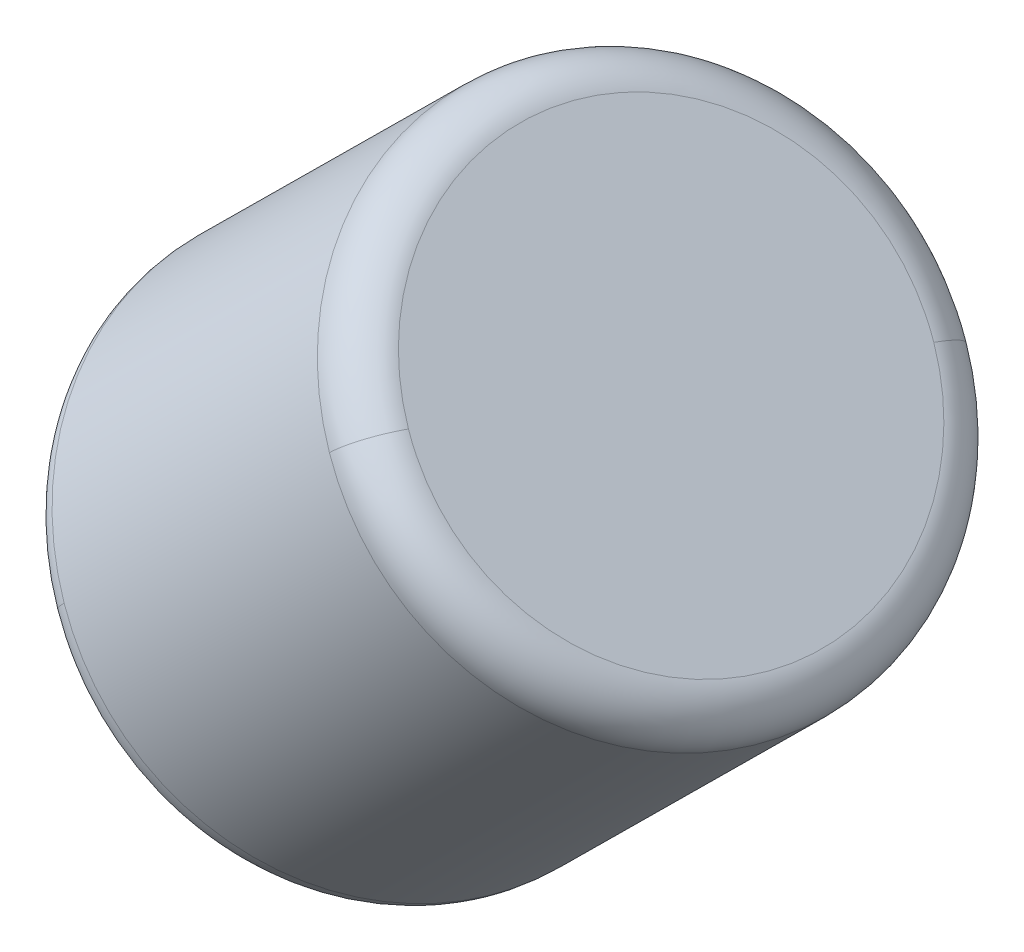
ISO-10303-21;
HEADER;
FILE_DESCRIPTION(('STEP AP214'),'2;1');
FILE_NAME('part.step','',(''),(''),'','','');
FILE_SCHEMA(('AUTOMOTIVE_DESIGN { 1 0 10303 214 1 1 1 1 }'));
ENDSEC;
DATA;
#1=APPLICATION_CONTEXT('core data for automotive mechanical design processes');
#2=APPLICATION_PROTOCOL_DEFINITION('international standard','automotive_design',2000,#1);
#3=PRODUCT_CONTEXT('',#1,'mechanical');
#4=PRODUCT('Part','Part','',(#3));
#5=PRODUCT_RELATED_PRODUCT_CATEGORY('part','',(#4));
#6=PRODUCT_DEFINITION_FORMATION('','',#4);
#7=PRODUCT_DEFINITION_CONTEXT('part definition',#1,'design');
#8=PRODUCT_DEFINITION('design','',#6,#7);
#9=PRODUCT_DEFINITION_SHAPE('','',#8);
#10=(LENGTH_UNIT() NAMED_UNIT(*) SI_UNIT(.MILLI.,.METRE.));
#11=(NAMED_UNIT(*) PLANE_ANGLE_UNIT() SI_UNIT($,.RADIAN.));
#12=(NAMED_UNIT(*) SI_UNIT($,.STERADIAN.) SOLID_ANGLE_UNIT());
#13=UNCERTAINTY_MEASURE_WITH_UNIT(LENGTH_MEASURE(1.E-05),#10,'distance_accuracy_value','');
#14=(GEOMETRIC_REPRESENTATION_CONTEXT(3) GLOBAL_UNCERTAINTY_ASSIGNED_CONTEXT((#13)) GLOBAL_UNIT_ASSIGNED_CONTEXT((#10,
#11,#12)) REPRESENTATION_CONTEXT('',''));
#15=CARTESIAN_POINT('',(0.,0.,0.));
#16=DIRECTION('',(0.,0.,1.));
#17=DIRECTION('',(1.,0.,0.));
#18=AXIS2_PLACEMENT_3D('',#15,#16,#17);
#19=CARTESIAN_POINT('',(10.1213203435597,49.7260987621381,6.28186714917047));
#20=DIRECTION('',(-0.707106781186513,-0.701531033014368,-0.0886239793613581));
#21=DIRECTION('',(0.704302354575459,-0.709900129130475,0.));
#22=AXIS2_PLACEMENT_3D('',#19,#20,#21);
#23=PLANE('',#22);
#24=CARTESIAN_POINT('',(9.42762951289511,50.1261189747011,8.65015278671473));
#25=CARTESIAN_POINT('',(9.40102429993113,50.15452615074,8.63756263833869));
#26=CARTESIAN_POINT('',(9.37469819089109,50.1827723565529,8.62401980572352));
#27=CARTESIAN_POINT('',(9.32266642371247,50.23887551971,8.59506494932473));
#28=CARTESIAN_POINT('',(9.29696076557391,50.2667324770543,8.5796529255411));
#29=CARTESIAN_POINT('',(9.24623214325189,50.3219898352575,8.54699586411519));
#30=CARTESIAN_POINT('',(9.22120917906843,50.3493902361165,8.5297508264729));
#31=CARTESIAN_POINT('',(9.17190614253156,50.403668524482,8.49346953711775));
#32=CARTESIAN_POINT('',(9.14762607017813,50.4305464119886,8.47443328540487));
#33=CARTESIAN_POINT('',(9.09986733280087,50.4837149082364,8.4346153595841));
#34=CARTESIAN_POINT('',(9.07638866777703,50.5100055169776,8.4138336854762));
#35=CARTESIAN_POINT('',(9.03028930114275,50.5619361231277,8.37057499804543));
#36=CARTESIAN_POINT('',(9.00766859953231,50.5875761205366,8.34809798472257));
#37=CARTESIAN_POINT('',(8.96333965660461,50.6381437340011,8.30150276305041));
#38=CARTESIAN_POINT('',(8.94163141528735,50.6630713500567,8.27738455470112));
#39=CARTESIAN_POINT('',(8.89917968956446,50.7121541482777,8.2275650471669));
#40=CARTESIAN_POINT('',(8.87843620515883,50.7363093304432,8.20186374798197));
#41=CARTESIAN_POINT('',(8.83796396624697,50.783789068861,8.1489399751052));
#42=CARTESIAN_POINT('',(8.81823521174073,50.8071136251135,8.12171750141335));
#43=CARTESIAN_POINT('',(8.77983996089395,50.8528759208259,8.06581696094064));
#44=CARTESIAN_POINT('',(8.76117346455342,50.8753136602859,8.03713889415978));
#45=CARTESIAN_POINT('',(8.72494769927112,50.9192482679286,7.97839625545853));
#46=CARTESIAN_POINT('',(8.70738843032936,50.9407451361113,7.94833168353814));
#47=CARTESIAN_POINT('',(8.67341942165925,50.9827462133624,7.88688846275171));
#48=CARTESIAN_POINT('',(8.6570096819309,51.0032504224309,7.85550981388567));
#49=CARTESIAN_POINT('',(8.62537926418855,51.0432167850174,7.79151403311969));
#50=CARTESIAN_POINT('',(8.61015858617455,51.0626789385356,7.75889690121975));
#51=CARTESIAN_POINT('',(8.58094295980724,51.1005143039893,7.69250273191412));
#52=CARTESIAN_POINT('',(8.56694801145393,51.1188875159248,7.65872569450844));
#53=CARTESIAN_POINT('',(8.54021755946446,51.1545007355363,7.59009308603282));
#54=CARTESIAN_POINT('',(8.52748205582828,51.1717407432122,7.55523751496288));
#55=CARTESIAN_POINT('',(8.50330117421682,51.2050460216161,7.4845318092825));
#56=CARTESIAN_POINT('',(8.49185579624153,51.221111292344,7.44868167467206));
#57=CARTESIAN_POINT('',(8.47028273886987,51.2520283942073,7.37607320802501));
#58=CARTESIAN_POINT('',(8.4601550594735,51.2668802253428,7.33931487598842));
#59=CARTESIAN_POINT('',(8.44124179772643,51.2953346686593,7.26497856853061));
#60=CARTESIAN_POINT('',(8.43245621537573,51.3089372808402,7.22740059310939));
#61=CARTESIAN_POINT('',(8.4162483129574,51.3348605163636,7.15151552751657));
#62=CARTESIAN_POINT('',(8.40882599288977,51.3471811397059,7.11320843734497));
#63=CARTESIAN_POINT('',(8.39536249605676,51.370510716091,7.0359574273869));
#64=CARTESIAN_POINT('',(8.38932131929137,51.3815196691339,6.99701350760043));
#65=CARTESIAN_POINT('',(8.37863466278681,51.402199383388,6.9185826577265));
#66=CARTESIAN_POINT('',(8.37398918304764,51.4118701445992,6.87909572763902));
#67=CARTESIAN_POINT('',(8.36610511196308,51.4298501774792,6.79967398463629));
#68=CARTESIAN_POINT('',(8.3628665206177,51.438159449148,6.75973917172103));
#69=CARTESIAN_POINT('',(8.35780402837096,51.45339648518,6.67951786952492));
#70=CARTESIAN_POINT('',(8.3559801274696,51.4603242495431,6.63923138024407));
#71=CARTESIAN_POINT('',(8.35375141004792,51.4727815813724,6.55840377899813));
#72=CARTESIAN_POINT('',(8.3533465935276,51.4783111488387,6.51786266703304));
#73=CARTESIAN_POINT('',(8.35395702010646,51.4879587656621,6.43662348750834));
#74=CARTESIAN_POINT('',(8.35497226320564,51.4920768150191,6.39592541994872));
#75=CARTESIAN_POINT('',(8.35842036321394,51.4988914748825,6.31447037444443));
#76=CARTESIAN_POINT('',(8.36085322012307,51.5015880853887,6.27371339649977));
#77=CARTESIAN_POINT('',(8.36713068678588,51.5055533711796,6.19223871735514));
#78=CARTESIAN_POINT('',(8.37097529653956,51.5068220464641,6.15152101615518));
#79=CARTESIAN_POINT('',(8.38006700688984,51.5079284054617,6.07022298300861));
#80=CARTESIAN_POINT('',(8.38531410748644,51.5077660891746,6.029642651062));
#81=CARTESIAN_POINT('',(8.39719815879763,51.5060108560632,5.94871711799621));
#82=CARTESIAN_POINT('',(8.40383510951222,51.5044179392387,5.90837191687703));
#83=CARTESIAN_POINT('',(8.41848287206378,51.4998053425285,5.8280138405894));
#84=CARTESIAN_POINT('',(8.42649368390075,51.4967856626428,5.78800096542096));
#85=CARTESIAN_POINT('',(8.4438698699497,51.4893268144833,5.70840393555582));
#86=CARTESIAN_POINT('',(8.45323524416168,51.4848876462097,5.66881978085912));
#87=CARTESIAN_POINT('',(8.47329799295386,51.4746005156195,5.59017555363328));
#88=CARTESIAN_POINT('',(8.48399536753406,51.4687525533031,5.55111548110414));
#89=CARTESIAN_POINT('',(8.50669634615034,51.4556619228809,5.47361351734942));
#90=CARTESIAN_POINT('',(8.51869995018642,51.4484192547752,5.43517162612383));
#91=CARTESIAN_POINT('',(8.54398446998093,51.4325566609963,5.35899863485927));
#92=CARTESIAN_POINT('',(8.55726538573938,51.4239367353231,5.3212675348203));
#93=CARTESIAN_POINT('',(8.58507253408929,51.4053403925652,5.24660702345383));
#94=CARTESIAN_POINT('',(8.59959876668076,51.3953639754805,5.20967761212633));
#95=CARTESIAN_POINT('',(8.62986155373007,51.3740786839622,5.13670944436932));
#96=CARTESIAN_POINT('',(8.64559810818791,51.3627698095286,5.10067068793981));
#97=CARTESIAN_POINT('',(8.67824362823191,51.3388468473815,5.02957065049965));
#98=CARTESIAN_POINT('',(8.69515259381807,51.3262327596681,4.99450936948899));
#99=CARTESIAN_POINT('',(8.73010220093956,51.2997297594035,4.92544874858349));
#100=CARTESIAN_POINT('',(8.7481428424749,51.2858408468523,4.89144940868865));
#101=CARTESIAN_POINT('',(8.78531234000911,51.2568216565192,4.82459457740257));
#102=CARTESIAN_POINT('',(8.80444119600799,51.2416913787373,4.79173908601133));
#103=CARTESIAN_POINT('',(8.84374103937969,51.2102259081069,4.72725110348903));
#104=CARTESIAN_POINT('',(8.86391202675251,51.1938907152586,4.69561861235797));
#105=CARTESIAN_POINT('',(8.90524753919677,51.1600547674058,4.63365283579783));
#106=CARTESIAN_POINT('',(8.92641206426819,51.1425540124014,4.60331955036875));
#107=CARTESIAN_POINT('',(8.96968366491495,51.1064291010882,4.54402526075407));
#108=CARTESIAN_POINT('',(8.99179074049029,51.0878049447795,4.51506425656846));
#109=CARTESIAN_POINT('',(9.03689418426345,51.0494780980815,4.45858429903647));
#110=CARTESIAN_POINT('',(9.05989055246128,51.0297754076923,4.43106534569009));
#111=CARTESIAN_POINT('',(9.10671718121421,50.9893389583401,4.37753578540556));
#112=CARTESIAN_POINT('',(9.1305474417693,50.9686051993773,4.3515251784674));
#113=CARTESIAN_POINT('',(9.1789844460518,50.9261565623194,4.30107497282969));
#114=CARTESIAN_POINT('',(9.20359118977919,50.9044416842243,4.27663537413012));
#115=CARTESIAN_POINT('',(9.25352188060536,50.8600831219453,4.22938606210352));
#116=CARTESIAN_POINT('',(9.27884582770412,50.8374394377614,4.20657634877648));
#117=CARTESIAN_POINT('',(9.33014991766634,50.7912778139231,4.16264175809221));
#118=CARTESIAN_POINT('',(9.35613006052979,50.7677598742689,4.14151688073499));
#119=CARTESIAN_POINT('',(9.40868395358165,50.7199063962666,4.10100285367023));
#120=CARTESIAN_POINT('',(9.43525770377004,50.6955708579186,4.0816137039627));
#121=CARTESIAN_POINT('',(9.48893479297998,50.6461408089721,4.04461784235726));
#122=CARTESIAN_POINT('',(9.51603813200153,50.6210462983738,4.02701113045936));
#123=CARTESIAN_POINT('',(9.5707091045601,50.5701587598007,3.9936225605843));
#124=CARTESIAN_POINT('',(9.59827673809712,50.544365731826,3.97784070260714));
#125=CARTESIAN_POINT('',(9.65380988684281,50.492143296164,3.94813986045181));
#126=CARTESIAN_POINT('',(9.68177540205147,50.4657138884766,3.93422087627363));
#127=CARTESIAN_POINT('',(9.73803694276484,50.4122823641472,3.90827931376816));
#128=CARTESIAN_POINT('',(9.76633296826955,50.3852802475052,3.89625673544087));
#129=CARTESIAN_POINT('',(9.82318736197101,50.3307683557306,3.87413694808192));
#130=CARTESIAN_POINT('',(9.85174573016775,50.3032585805981,3.86403973905026));
#131=CARTESIAN_POINT('',(9.90905600964335,50.2477976453002,3.84579501534167));
#132=CARTESIAN_POINT('',(9.93780792092221,50.2198464851348,3.83764750066474));
#133=CARTESIAN_POINT('',(9.99543602068761,50.1635701165651,3.8233217937491));
#134=CARTESIAN_POINT('',(10.0243122091742,50.1352449081608,3.81714360151039));
#135=CARTESIAN_POINT('',(10.0821192980943,50.078288681018,3.80677142325132));
#136=CARTESIAN_POINT('',(10.1110501985278,50.0496576622795,3.80257743723097));
#137=CARTESIAN_POINT('',(10.168897014244,49.9921587891128,3.79618377518572));
#138=CARTESIAN_POINT('',(10.1978129295265,49.9632909346847,3.79398409916083));
#139=CARTESIAN_POINT('',(10.2555601140607,49.9053879352811,3.79158435595511));
#140=CARTESIAN_POINT('',(10.2843913833123,49.8763527903057,3.79138428877429));
#141=CARTESIAN_POINT('',(10.3418998183856,49.8181851581924,3.79298424659307));
#142=CARTESIAN_POINT('',(10.3705769842072,49.7890526710546,3.79478427159269));
#143=CARTESIAN_POINT('',(10.427708127908,49.7307605366673,3.80038007229002));
#144=CARTESIAN_POINT('',(10.4561621057873,49.7016008894178,3.80417584798773));
#145=CARTESIAN_POINT('',(10.5127783206567,49.643324685424,3.81375402462594));
#146=CARTESIAN_POINT('',(10.5409405576469,49.6142081286795,3.81953642556643));
#147=CARTESIAN_POINT('',(10.5969054634375,49.5560882408043,3.83307385184109));
#148=CARTESIAN_POINT('',(10.6247081322379,49.5270849096735,3.84082887717528));
#149=CARTESIAN_POINT('',(10.6798868554265,49.4692613790259,3.85829313295618));
#150=CARTESIAN_POINT('',(10.7072629098147,49.440441179509,3.8680023634029));
#151=CARTESIAN_POINT('',(10.7615227035036,49.3830532139603,3.8893506565445));
#152=CARTESIAN_POINT('',(10.7884064428043,49.3544854479285,3.90098971923938));
#153=CARTESIAN_POINT('',(10.8150111742237,49.3260785495746,3.91358151162614));
#154=B_SPLINE_CURVE_WITH_KNOTS('',3,(#24,#25,#26,#27,#28,#29,#30,#31,#32,#33,#34,#35,#36,#37,
#38,#39,#40,#41,#42,#43,#44,#45,#46,#47,#48,#49,#50,#51,#52,#53,#54,#55,#56,#57,#58,#59,#60,#61,
#62,#63,#64,#65,#66,#67,#68,#69,#70,#71,#72,#73,#74,#75,#76,#77,#78,#79,#80,#81,#82,#83,#84,#85,
#86,#87,#88,#89,#90,#91,#92,#93,#94,#95,#96,#97,#98,#99,#100,#101,#102,#103,#104,#105,#106,#107,
#108,#109,#110,#111,#112,#113,#114,#115,#116,#117,#118,#119,#120,#121,#122,#123,#124,#125,#126,
#127,#128,#129,#130,#131,#132,#133,#134,#135,#136,#137,#138,#139,#140,#141,#142,#143,#144,#145,
#146,#147,#148,#149,#150,#151,#152,#153),.UNSPECIFIED.,.F.,.F.,(4,2,2,2,2,2,2,2,2,2,2,2,2,2,2,2,
2,2,2,2,2,2,2,2,2,2,2,2,2,2,2,2,2,2,2,2,2,2,2,2,2,2,2,2,2,2,2,2,2,2,2,2,2,2,2,2,2,2,2,2,2,2,2,2,
4),(0.,0.122706142614616,0.245412285229231,0.368118427843847,0.490824570458458,
0.613530713073075,0.736236855687689,0.858942998302303,0.981649140916921,1.10435528353153,
1.22706142614615,1.34976756876077,1.47247371137538,1.59517985398999,1.71788599660461,
1.84059213921922,1.96329828183384,2.08600442444845,2.20871056706307,2.33141670967768,
2.4541228522923,2.57682899490691,2.69953513752153,2.82224128013614,2.94494742275076,
3.06765356536537,3.19035970797999,3.3130658505946,3.43577199320922,3.55847813582383,
3.68118427843845,3.80389042105306,3.92659656366768,4.04930270628229,4.17200884889691,
4.29471499151152,4.41742113412613,4.54012727674075,4.66283341935537,4.78553956196998,
4.9082457045846,5.03095184719921,5.15365798981383,5.27636413242844,5.39907027504305,
5.52177641765767,5.64448256027228,5.7671887028869,5.88989484550151,6.01260098811613,
6.13530713073074,6.25801327334536,6.38071941595998,6.50342555857459,6.6261317011892,
6.74883784380382,6.87154398641844,6.99425012903305,7.11695627164767,7.23966241426228,
7.36236855687689,7.48507469949151,7.60778084210613,7.73048698472074,7.85319312733535),.UNSPECIFIED.);
#155=CARTESIAN_POINT('',(9.42762951289511,50.1261189747011,8.65015278671473));
#156=VERTEX_POINT('',#155);
#157=CARTESIAN_POINT('',(10.8150111742237,49.3260785495746,3.91358151162614));
#158=VERTEX_POINT('',#157);
#159=EDGE_CURVE('E11',#156,#158,#154,.T.);
#160=ORIENTED_EDGE('',*,*,#159,.F.);
#161=CARTESIAN_POINT('',(10.8150111742237,49.3260785495746,3.91358151162614));
#162=CARTESIAN_POINT('',(10.8416163871877,49.2976713735358,3.92617166000217));
#163=CARTESIAN_POINT('',(10.8679424962277,49.2694251677229,3.93971449261734));
#164=CARTESIAN_POINT('',(10.9199742634063,49.2133220045657,3.96866934901614));
#165=CARTESIAN_POINT('',(10.9456799215449,49.1854650472215,3.98408137279976));
#166=CARTESIAN_POINT('',(10.9964085438669,49.1302076890182,4.01673843422568));
#167=CARTESIAN_POINT('',(11.0214315080504,49.1028072881592,4.03398347186796));
#168=CARTESIAN_POINT('',(11.0707345445873,49.0485289997937,4.07026476122312));
#169=CARTESIAN_POINT('',(11.0950146169407,49.0216511122871,4.08930101293599));
#170=CARTESIAN_POINT('',(11.142773354318,48.9684826160394,4.12911893875676));
#171=CARTESIAN_POINT('',(11.1662520193418,48.9421920072982,4.14990061286467));
#172=CARTESIAN_POINT('',(11.2123513859761,48.890261401148,4.19315930029543));
#173=CARTESIAN_POINT('',(11.2349720875865,48.8646214037391,4.21563631361829));
#174=CARTESIAN_POINT('',(11.2793010305142,48.8140537902746,4.26223153529045));
#175=CARTESIAN_POINT('',(11.3010092718315,48.789126174219,4.28634974363975));
#176=CARTESIAN_POINT('',(11.3434609975544,48.740043375998,4.33616925117397));
#177=CARTESIAN_POINT('',(11.36420448196,48.7158881938326,4.3618705503589));
#178=CARTESIAN_POINT('',(11.4046767208719,48.6684084554147,4.41479432323567));
#179=CARTESIAN_POINT('',(11.4244054753781,48.6450838991623,4.44201679692751));
#180=CARTESIAN_POINT('',(11.4628007262249,48.5993216034498,4.49791733740022));
#181=CARTESIAN_POINT('',(11.4814672225654,48.5768838639898,4.52659540418109));
#182=CARTESIAN_POINT('',(11.5176929878477,48.5329492563471,4.58533804288234));
#183=CARTESIAN_POINT('',(11.5352522567895,48.5114523881644,4.61540261480273));
#184=CARTESIAN_POINT('',(11.5692212654596,48.4694513109133,4.67684583558916));
#185=CARTESIAN_POINT('',(11.5856310051879,48.4489471018449,4.7082244844552));
#186=CARTESIAN_POINT('',(11.6172614229303,48.4089807392583,4.77222026522118));
#187=CARTESIAN_POINT('',(11.6324821009443,48.3895185857401,4.80483739712112));
#188=CARTESIAN_POINT('',(11.6616977273116,48.3516832202864,4.87123156642674));
#189=CARTESIAN_POINT('',(11.6756926756649,48.3333100083509,4.90500860383243));
#190=CARTESIAN_POINT('',(11.7024231276544,48.2976967887395,4.97364121230805));
#191=CARTESIAN_POINT('',(11.7151586312905,48.2804567810635,5.00849678337798));
#192=CARTESIAN_POINT('',(11.739339512902,48.2471515026597,5.07920248905836));
#193=CARTESIAN_POINT('',(11.7507848908773,48.2310862319318,5.11505262366881));
#194=CARTESIAN_POINT('',(11.772357948249,48.2001691300684,5.18766109031585));
#195=CARTESIAN_POINT('',(11.7824856276453,48.1853172989329,5.22441942235245));
#196=CARTESIAN_POINT('',(11.8013988893924,48.1568628556165,5.29875572981026));
#197=CARTESIAN_POINT('',(11.8101844717431,48.1432602434355,5.33633370523147));
#198=CARTESIAN_POINT('',(11.8263923741614,48.1173370079122,5.41221877082429));
#199=CARTESIAN_POINT('',(11.833814694229,48.1050163845699,5.4505258609959));
#200=CARTESIAN_POINT('',(11.8472781910621,48.0816868081847,5.52777687095396));
#201=CARTESIAN_POINT('',(11.8533193678274,48.0706778551418,5.56672079074043));
#202=CARTESIAN_POINT('',(11.864006024332,48.0499981408878,5.64515164061437));
#203=CARTESIAN_POINT('',(11.8686515040712,48.0403273796765,5.68463857070184));
#204=CARTESIAN_POINT('',(11.8765355751557,48.0223473467965,5.76406031370457));
#205=CARTESIAN_POINT('',(11.8797741665011,48.0140380751277,5.80399512661983));
#206=CARTESIAN_POINT('',(11.8848366587479,47.9988010390958,5.88421642881594));
#207=CARTESIAN_POINT('',(11.8866605596492,47.9918732747327,5.92450291809679));
#208=CARTESIAN_POINT('',(11.8888892770709,47.9794159429033,6.00533051934273));
#209=CARTESIAN_POINT('',(11.8892940935912,47.973886375437,6.04587163130782));
#210=CARTESIAN_POINT('',(11.8886836670124,47.9642387586137,6.12711081083252));
#211=CARTESIAN_POINT('',(11.8876684239132,47.9601207092566,6.16780887839214));
#212=CARTESIAN_POINT('',(11.8842203239049,47.9533060493933,6.24926392389643));
#213=CARTESIAN_POINT('',(11.8817874669958,47.950609438887,6.29002090184109));
#214=CARTESIAN_POINT('',(11.8755100003329,47.9466441530962,6.37149558098572));
#215=CARTESIAN_POINT('',(11.8716653905793,47.9453754778116,6.41221328218568));
#216=CARTESIAN_POINT('',(11.862573680229,47.9442691188141,6.49351131533225));
#217=CARTESIAN_POINT('',(11.8573265796324,47.9444314351011,6.53409164727886));
#218=CARTESIAN_POINT('',(11.8454425283212,47.9461866682126,6.61501718034465));
#219=CARTESIAN_POINT('',(11.8388055776066,47.947779585037,6.65536238146383));
#220=CARTESIAN_POINT('',(11.824157815055,47.9523921817472,6.73572045775146));
#221=CARTESIAN_POINT('',(11.8161470032181,47.955411861633,6.7757333329199));
#222=CARTESIAN_POINT('',(11.7987708171691,47.9628707097924,6.85533036278504));
#223=CARTESIAN_POINT('',(11.7894054429571,47.9673098780661,6.89491451748174));
#224=CARTESIAN_POINT('',(11.769342694165,47.9775970086562,6.97355874470758));
#225=CARTESIAN_POINT('',(11.7586453195848,47.9834449709726,7.01261881723672));
#226=CARTESIAN_POINT('',(11.7359443409685,47.9965356013948,7.09012078099144));
#227=CARTESIAN_POINT('',(11.7239407369324,48.0037782695005,7.12856267221703));
#228=CARTESIAN_POINT('',(11.6986562171379,48.0196408632795,7.20473566348159));
#229=CARTESIAN_POINT('',(11.6853753013794,48.0282607889527,7.24246676352056));
#230=CARTESIAN_POINT('',(11.6575681530295,48.0468571317106,7.31712727488703));
#231=CARTESIAN_POINT('',(11.6430419204381,48.0568335487953,7.35405668621453));
#232=CARTESIAN_POINT('',(11.6127791333888,48.0781188403135,7.42702485397154));
#233=CARTESIAN_POINT('',(11.5970425789309,48.0894277147471,7.46306361040105));
#234=CARTESIAN_POINT('',(11.5643970588869,48.1133506768942,7.53416364784121));
#235=CARTESIAN_POINT('',(11.5474880933008,48.1259647646076,7.56922492885187));
#236=CARTESIAN_POINT('',(11.5125384861793,48.1524677648722,7.63828554975737));
#237=CARTESIAN_POINT('',(11.4944978446439,48.1663566774234,7.67228488965222));
#238=CARTESIAN_POINT('',(11.4573283471097,48.1953758677565,7.73913972093829));
#239=CARTESIAN_POINT('',(11.4381994911108,48.2105061455385,7.77199521232953));
#240=CARTESIAN_POINT('',(11.3988996477391,48.2419716161688,7.83648319485183));
#241=CARTESIAN_POINT('',(11.3787286603663,48.2583068090172,7.86811568598289));
#242=CARTESIAN_POINT('',(11.3373931479221,48.2921427568699,7.93008146254303));
#243=CARTESIAN_POINT('',(11.3162286228506,48.3096435118743,7.96041474797211));
#244=CARTESIAN_POINT('',(11.2729570222039,48.3457684231875,8.0197090375868));
#245=CARTESIAN_POINT('',(11.2508499466285,48.3643925794962,8.04867004177241));
#246=CARTESIAN_POINT('',(11.2057465028554,48.4027194261942,8.1051499993044));
#247=CARTESIAN_POINT('',(11.1827501346575,48.4224221165835,8.13266895265077));
#248=CARTESIAN_POINT('',(11.1359235059046,48.4628585659356,8.18619851293531));
#249=CARTESIAN_POINT('',(11.1120932453495,48.4835923248984,8.21220911987346));
#250=CARTESIAN_POINT('',(11.063656241067,48.5260409619564,8.26265932551118));
#251=CARTESIAN_POINT('',(11.0390494973396,48.5477558400514,8.28709892421074));
#252=CARTESIAN_POINT('',(10.9891188065135,48.5921144023304,8.33434823623734));
#253=CARTESIAN_POINT('',(10.9637948594147,48.6147580865144,8.35715794956438));
#254=CARTESIAN_POINT('',(10.9124907694525,48.6609197103526,8.40109254024865));
#255=CARTESIAN_POINT('',(10.886510626589,48.6844376500068,8.42221741760588));
#256=CARTESIAN_POINT('',(10.8339567335372,48.7322911280091,8.46273144467063));
#257=CARTESIAN_POINT('',(10.8073829833488,48.7566266663572,8.48212059437816));
#258=CARTESIAN_POINT('',(10.7537058941388,48.8060567153036,8.5191164559836));
#259=CARTESIAN_POINT('',(10.7266025551173,48.831151225902,8.5367231678815));
#260=CARTESIAN_POINT('',(10.6719315825587,48.882038764475,8.57011173775656));
#261=CARTESIAN_POINT('',(10.6443639490217,48.9078317924497,8.58589359573372));
#262=CARTESIAN_POINT('',(10.588830800276,48.9600542281117,8.61559443788905));
#263=CARTESIAN_POINT('',(10.5608652850674,48.9864836357991,8.62951342206723));
#264=CARTESIAN_POINT('',(10.504603744354,49.0399151601285,8.6554549845727));
#265=CARTESIAN_POINT('',(10.4763077188493,49.0669172767706,8.66747756289999));
#266=CARTESIAN_POINT('',(10.4194533251478,49.1214291685451,8.68959735025894));
#267=CARTESIAN_POINT('',(10.3908949569511,49.1489389436776,8.6996945592906));
#268=CARTESIAN_POINT('',(10.3335846774755,49.2043998789756,8.71793928299919));
#269=CARTESIAN_POINT('',(10.3048327661966,49.2323510391409,8.72608679767612));
#270=CARTESIAN_POINT('',(10.2472046664312,49.2886274077106,8.74041250459176));
#271=CARTESIAN_POINT('',(10.2183284779447,49.3169526161149,8.74659069683048));
#272=CARTESIAN_POINT('',(10.1605213890246,49.3739088432577,8.75696287508955));
#273=CARTESIAN_POINT('',(10.131590488591,49.4025398619962,8.7611568611099));
#274=CARTESIAN_POINT('',(10.0737436728749,49.4600387351629,8.76755052315514));
#275=CARTESIAN_POINT('',(10.0448277575923,49.488906589591,8.76975019918003));
#276=CARTESIAN_POINT('',(9.98708057305812,49.5468095889946,8.77214994238575));
#277=CARTESIAN_POINT('',(9.95824930380648,49.5758447339701,8.77235000956658));
#278=CARTESIAN_POINT('',(9.90074086873324,49.6340123660833,8.77075005174779));
#279=CARTESIAN_POINT('',(9.87206370291165,49.6631448532212,8.76895002674818));
#280=CARTESIAN_POINT('',(9.81493255921081,49.7214369876084,8.76335422605085));
#281=CARTESIAN_POINT('',(9.78647858133156,49.7505966348579,8.75955845035313));
#282=CARTESIAN_POINT('',(9.72986236646214,49.8088728388518,8.74998027371493));
#283=CARTESIAN_POINT('',(9.70170012947197,49.8379893955962,8.74419787277444));
#284=CARTESIAN_POINT('',(9.64573522368136,49.8961092834714,8.73066044649977));
#285=CARTESIAN_POINT('',(9.61793255488091,49.9251126146022,8.72290542116559));
#286=CARTESIAN_POINT('',(9.56275383169229,49.9829361452498,8.70544116538469));
#287=CARTESIAN_POINT('',(9.5353777773041,50.0117563447667,8.69573193493797));
#288=CARTESIAN_POINT('',(9.4811179836152,50.0691443103154,8.67438364179637));
#289=CARTESIAN_POINT('',(9.45423424431449,50.0977120763473,8.66274457910149));
#290=CARTESIAN_POINT('',(9.42762951289511,50.1261189747011,8.65015278671473));
#291=B_SPLINE_CURVE_WITH_KNOTS('',3,(#161,#162,#163,#164,#165,#166,#167,#168,#169,#170,#171,
#172,#173,#174,#175,#176,#177,#178,#179,#180,#181,#182,#183,#184,#185,#186,#187,#188,#189,#190,
#191,#192,#193,#194,#195,#196,#197,#198,#199,#200,#201,#202,#203,#204,#205,#206,#207,#208,#209,
#210,#211,#212,#213,#214,#215,#216,#217,#218,#219,#220,#221,#222,#223,#224,#225,#226,#227,#228,
#229,#230,#231,#232,#233,#234,#235,#236,#237,#238,#239,#240,#241,#242,#243,#244,#245,#246,#247,
#248,#249,#250,#251,#252,#253,#254,#255,#256,#257,#258,#259,#260,#261,#262,#263,#264,#265,#266,
#267,#268,#269,#270,#271,#272,#273,#274,#275,#276,#277,#278,#279,#280,#281,#282,#283,#284,#285,
#286,#287,#288,#289,#290),.UNSPECIFIED.,.F.,.F.,(4,2,2,2,2,2,2,2,2,2,2,2,2,2,2,2,2,2,2,2,2,2,2,
2,2,2,2,2,2,2,2,2,2,2,2,2,2,2,2,2,2,2,2,2,2,2,2,2,2,2,2,2,2,2,2,2,2,2,2,2,2,2,2,2,4),(0.,
0.122706142614616,0.245412285229231,0.368118427843847,0.490824570458462,0.613530713073074,
0.736236855687692,0.858942998302303,0.98164914091692,1.10435528353153,1.22706142614615,
1.34976756876076,1.47247371137538,1.59517985398999,1.71788599660461,1.84059213921922,
1.96329828183384,2.08600442444845,2.20871056706307,2.33141670967768,2.4541228522923,
2.57682899490691,2.69953513752153,2.82224128013614,2.94494742275076,3.06765356536537,
3.19035970797999,3.3130658505946,3.43577199320922,3.55847813582383,3.68118427843845,
3.80389042105306,3.92659656366768,4.04930270628229,4.1720088488969,4.29471499151152,
4.41742113412614,4.54012727674075,4.66283341935536,4.78553956196998,4.90824570458459,
5.03095184719921,5.15365798981382,5.27636413242844,5.39907027504305,5.52177641765767,
5.64448256027228,5.7671887028869,5.88989484550151,6.01260098811613,6.13530713073074,
6.25801327334535,6.38071941595997,6.50342555857459,6.6261317011892,6.74883784380381,
6.87154398641843,6.99425012903304,7.11695627164766,7.23966241426228,7.36236855687689,
7.48507469949151,7.60778084210612,7.73048698472074,7.85319312733535),.UNSPECIFIED.);
#292=EDGE_CURVE('E26',#158,#156,#291,.T.);
#293=ORIENTED_EDGE('',*,*,#292,.F.);
#294=EDGE_LOOP('',(#160,#293));
#295=FACE_BOUND('',#294,.T.);
#296=ADVANCED_FACE('F17',(#295),#23,.F.);
#297=CARTESIAN_POINT('',(9.76776695296708,49.3753332456316,6.23755515948987));
#298=DIRECTION('',(-0.707106781186513,-0.701531033014368,-0.0886239793613581));
#299=DIRECTION('',(-0.650389794686601,0.694443390381359,-0.307801059977325));
#300=AXIS2_PLACEMENT_3D('',#297,#298,#299);
#301=TOROIDAL_SURFACE('',#300,2.50000000000109,0.499999999998692);
#302=CARTESIAN_POINT('',(10.4614577836314,48.9753130330684,3.86926952194557));
#303=DIRECTION('',(0.650389794686602,-0.694443390381359,0.307801059977322));
#304=DIRECTION('',(0.277476332264223,-0.160008085026582,-0.947314255017479));
#305=AXIS2_PLACEMENT_3D('',#302,#303,#304);
#306=CIRCLE('',#305,0.499999999998692);
#307=CARTESIAN_POINT('',(10.6001959497631,48.8953089905553,3.39561239443807));
#308=VERTEX_POINT('',#307);
#309=EDGE_CURVE('E139',#308,#158,#306,.T.);
#310=ORIENTED_EDGE('',*,*,#309,.T.);
#311=ORIENTED_EDGE('',*,*,#292,.T.);
#312=CARTESIAN_POINT('',(9.07407612230278,49.7753534581948,8.60584079703417));
#313=DIRECTION('',(-0.650389794686602,0.694443390381359,-0.307801059977324));
#314=DIRECTION('',(-0.277476332266976,0.160008085023853,0.947314255017133));
#315=AXIS2_PLACEMENT_3D('',#312,#313,#314);
#316=CIRCLE('',#315,0.499999999998693);
#317=CARTESIAN_POINT('',(8.93533795616965,49.8553575007065,9.0794979245415));
#318=VERTEX_POINT('',#317);
#319=EDGE_CURVE('E135',#318,#156,#316,.T.);
#320=ORIENTED_EDGE('',*,*,#319,.F.);
#321=CARTESIAN_POINT('',(9.76776695296641,49.3753332456309,6.23755515948979));
#322=DIRECTION('',(-0.707106781186513,-0.701531033014368,-0.0886239793613581));
#323=DIRECTION('',(0.704302354575459,-0.709900129130475,0.));
#324=AXIS2_PLACEMENT_3D('',#321,#322,#323);
#325=CIRCLE('',#324,2.99999999999978);
#326=CARTESIAN_POINT('',(11.8806740166926,47.2456328582396,6.23755515948979));
#327=VERTEX_POINT('',#326);
#328=EDGE_CURVE('E130',#327,#318,#325,.T.);
#329=ORIENTED_EDGE('',*,*,#328,.F.);
#330=CARTESIAN_POINT('',(9.76776695296641,49.3753332456309,6.23755515948979));
#331=DIRECTION('',(-0.707106781186513,-0.701531033014368,-0.0886239793613581));
#332=DIRECTION('',(0.704302354575459,-0.709900129130475,0.));
#333=AXIS2_PLACEMENT_3D('',#330,#331,#332);
#334=CIRCLE('',#333,2.99999999999978);
#335=EDGE_CURVE('E125',#308,#327,#334,.T.);
#336=ORIENTED_EDGE('',*,*,#335,.F.);
#337=EDGE_LOOP('',(#310,#311,#320,#329,#336));
#338=FACE_BOUND('',#337,.T.);
#339=ADVANCED_FACE('F146',(#338),#301,.T.);
#340=CARTESIAN_POINT('',(5.8786796564404,45.5169125640517,5.75012327300229));
#341=DIRECTION('',(-0.707106781186513,-0.701531033014368,-0.0886239793613582));
#342=DIRECTION('',(-0.0629141743926853,-0.0624180773360509,0.996065153633113));
#343=AXIS2_PLACEMENT_3D('',#340,#341,#342);
#344=CYLINDRICAL_SURFACE('',#343,2.99999999999977);
#345=DIRECTION('',(-0.707106781186513,-0.701531033014368,-0.0886239793613581));
#346=VECTOR('',#345,1.);
#347=CARTESIAN_POINT('',(7.65485988924019,51.5050336330222,6.23755515948978));
#348=LINE('',#347,#346);
#349=CARTESIAN_POINT('',(7.65485988924019,51.5050336330222,6.23755515948978));
#350=VERTEX_POINT('',#349);
#351=CARTESIAN_POINT('',(4.11932598330749,47.9973784679502,5.79443526268297));
#352=VERTEX_POINT('',#351);
#353=EDGE_CURVE('E92',#350,#352,#348,.T.);
#354=ORIENTED_EDGE('',*,*,#353,.F.);
#355=CARTESIAN_POINT('',(9.76776695296641,49.3753332456309,6.23755515948979));
#356=DIRECTION('',(-0.707106781186513,-0.701531033014368,-0.0886239793613581));
#357=DIRECTION('',(0.704302354575459,-0.709900129130475,0.));
#358=AXIS2_PLACEMENT_3D('',#355,#356,#357);
#359=CIRCLE('',#358,2.99999999999978);
#360=EDGE_CURVE('E117',#350,#308,#359,.T.);
#361=ORIENTED_EDGE('',*,*,#360,.T.);
#362=ORIENTED_EDGE('',*,*,#335,.T.);
#363=DIRECTION('',(-0.707106781186513,-0.701531033014368,-0.0886239793613581));
#364=VECTOR('',#363,1.);
#365=CARTESIAN_POINT('',(11.8806740166926,47.2456328582396,6.23755515948978));
#366=LINE('',#365,#364);
#367=CARTESIAN_POINT('',(8.34514011075994,43.7379776931677,5.79443526268298));
#368=VERTEX_POINT('',#367);
#369=EDGE_CURVE('E113',#327,#368,#366,.T.);
#370=ORIENTED_EDGE('',*,*,#369,.T.);
#371=CARTESIAN_POINT('',(6.23223304703373,45.8676780805589,5.79443526268298));
#372=DIRECTION('',(-0.707106781186513,-0.701531033014368,-0.0886239793613581));
#373=DIRECTION('',(0.704302354575459,-0.709900129130475,0.));
#374=AXIS2_PLACEMENT_3D('',#371,#372,#373);
#375=CIRCLE('',#374,2.99999999999975);
#376=CARTESIAN_POINT('',(7.06466204383044,45.3876538254833,2.9524924976313));
#377=VERTEX_POINT('',#376);
#378=EDGE_CURVE('E84',#377,#368,#375,.T.);
#379=ORIENTED_EDGE('',*,*,#378,.F.);
#380=CARTESIAN_POINT('',(6.23223304703373,45.8676780805589,5.79443526268298));
#381=DIRECTION('',(-0.707106781186513,-0.701531033014368,-0.0886239793613581));
#382=DIRECTION('',(0.704302354575459,-0.709900129130475,0.));
#383=AXIS2_PLACEMENT_3D('',#380,#381,#382);
#384=CIRCLE('',#383,2.99999999999975);
#385=EDGE_CURVE('E106',#352,#377,#384,.T.);
#386=ORIENTED_EDGE('',*,*,#385,.F.);
#387=EDGE_LOOP('',(#354,#361,#362,#370,#379,#386));
#388=FACE_BOUND('',#387,.T.);
#389=ADVANCED_FACE('F155',(#388),#344,.T.);
#390=CARTESIAN_POINT('',(6.23223304703329,45.8676780805585,5.79443526268293));
#391=DIRECTION('',(-0.707106781186513,-0.701531033014368,-0.0886239793613581));
#392=DIRECTION('',(0.650389794686601,-0.694443390381359,0.307801059977325));
#393=AXIS2_PLACEMENT_3D('',#390,#391,#392);
#394=TOROIDAL_SURFACE('',#393,2.50000000000037,0.49999999999939);
#395=CARTESIAN_POINT('',(6.92592387769739,45.4676578679954,3.42614962513932));
#396=DIRECTION('',(0.650389794686606,-0.694443390381354,0.307801059977325));
#397=DIRECTION('',(-0.707106781186507,-0.701531033014373,-0.0886239793613609));
#398=AXIS2_PLACEMENT_3D('',#395,#396,#397);
#399=CIRCLE('',#398,0.499999999999394);
#400=CARTESIAN_POINT('',(6.57237048710456,45.1168923514886,3.38183763545869));
#401=VERTEX_POINT('',#400);
#402=EDGE_CURVE('E102',#401,#377,#399,.T.);
#403=ORIENTED_EDGE('',*,*,#402,.F.);
#404=CARTESIAN_POINT('',(5.87867965644046,45.5169125640517,5.7501232730023));
#405=DIRECTION('',(-0.707106781186513,-0.701531033014368,-0.0886239793613581));
#406=DIRECTION('',(0.704302354575459,-0.709900129130475,0.));
#407=AXIS2_PLACEMENT_3D('',#404,#405,#406);
#408=CIRCLE('',#407,2.4999999999997);
#409=CARTESIAN_POINT('',(5.18498882577637,45.9169327766148,8.11840891054592));
#410=VERTEX_POINT('',#409);
#411=EDGE_CURVE('E74',#410,#401,#408,.T.);
#412=ORIENTED_EDGE('',*,*,#411,.F.);
#413=CARTESIAN_POINT('',(5.53854221636919,46.2676982931216,8.16272090022654));
#414=DIRECTION('',(-0.6503897946866,0.69444339038136,-0.307801059977325));
#415=DIRECTION('',(-0.707106781186515,-0.701531033014367,-0.0886239793613565));
#416=AXIS2_PLACEMENT_3D('',#413,#414,#415);
#417=CIRCLE('',#416,0.499999999999389);
#418=CARTESIAN_POINT('',(5.39980405023698,46.3477023356345,8.63637802773467));
#419=VERTEX_POINT('',#418);
#420=EDGE_CURVE('E67',#410,#419,#417,.T.);
#421=ORIENTED_EDGE('',*,*,#420,.T.);
#422=CARTESIAN_POINT('',(6.23223304703373,45.8676780805589,5.79443526268298));
#423=DIRECTION('',(-0.707106781186513,-0.701531033014368,-0.0886239793613581));
#424=DIRECTION('',(0.704302354575459,-0.709900129130475,0.));
#425=AXIS2_PLACEMENT_3D('',#422,#423,#424);
#426=CIRCLE('',#425,2.99999999999975);
#427=EDGE_CURVE('E72',#419,#352,#426,.T.);
#428=ORIENTED_EDGE('',*,*,#427,.T.);
#429=ORIENTED_EDGE('',*,*,#385,.T.);
#430=EDGE_LOOP('',(#403,#412,#421,#428,#429));
#431=FACE_BOUND('',#430,.T.);
#432=ADVANCED_FACE('F69',(#431),#394,.T.);
#433=CARTESIAN_POINT('',(5.8786796564404,45.5169125640517,5.75012327300229));
#434=DIRECTION('',(-0.707106781186513,-0.701531033014368,-0.0886239793613581));
#435=DIRECTION('',(0.0629141743926848,0.0624180773360512,-0.996065153633113));
#436=AXIS2_PLACEMENT_3D('',#433,#434,#435);
#437=CYLINDRICAL_SURFACE('',#436,2.99999999999977);
#438=ORIENTED_EDGE('',*,*,#353,.T.);
#439=ORIENTED_EDGE('',*,*,#427,.F.);
#440=CARTESIAN_POINT('',(6.23223304703373,45.8676780805589,5.79443526268298));
#441=DIRECTION('',(-0.707106781186513,-0.701531033014368,-0.0886239793613581));
#442=DIRECTION('',(0.704302354575459,-0.709900129130475,0.));
#443=AXIS2_PLACEMENT_3D('',#440,#441,#442);
#444=CIRCLE('',#443,2.99999999999975);
#445=EDGE_CURVE('E81',#368,#419,#444,.T.);
#446=ORIENTED_EDGE('',*,*,#445,.F.);
#447=ORIENTED_EDGE('',*,*,#369,.F.);
#448=ORIENTED_EDGE('',*,*,#328,.T.);
#449=CARTESIAN_POINT('',(9.76776695296641,49.3753332456309,6.23755515948979));
#450=DIRECTION('',(-0.707106781186513,-0.701531033014368,-0.0886239793613581));
#451=DIRECTION('',(0.704302354575459,-0.709900129130475,0.));
#452=AXIS2_PLACEMENT_3D('',#449,#450,#451);
#453=CIRCLE('',#452,2.99999999999978);
#454=EDGE_CURVE('E87',#318,#350,#453,.T.);
#455=ORIENTED_EDGE('',*,*,#454,.T.);
#456=EDGE_LOOP('',(#438,#439,#446,#447,#448,#455));
#457=FACE_BOUND('',#456,.T.);
#458=ADVANCED_FACE('F90',(#457),#437,.T.);
#459=CARTESIAN_POINT('',(9.76776695296708,49.3753332456316,6.23755515948987));
#460=DIRECTION('',(-0.707106781186513,-0.701531033014368,-0.0886239793613581));
#461=DIRECTION('',(0.650389794686601,-0.694443390381359,0.307801059977325));
#462=AXIS2_PLACEMENT_3D('',#459,#460,#461);
#463=TOROIDAL_SURFACE('',#462,2.50000000000109,0.499999999998692);
#464=ORIENTED_EDGE('',*,*,#309,.F.);
#465=ORIENTED_EDGE('',*,*,#360,.F.);
#466=ORIENTED_EDGE('',*,*,#454,.F.);
#467=ORIENTED_EDGE('',*,*,#319,.T.);
#468=ORIENTED_EDGE('',*,*,#159,.T.);
#469=EDGE_LOOP('',(#464,#465,#466,#467,#468));
#470=FACE_BOUND('',#469,.T.);
#471=ADVANCED_FACE('F164',(#470),#463,.T.);
#472=CARTESIAN_POINT('',(6.23223304703329,45.8676780805585,5.79443526268293));
#473=DIRECTION('',(-0.707106781186513,-0.701531033014368,-0.0886239793613581));
#474=DIRECTION('',(-0.650389794686601,0.694443390381359,-0.307801059977325));
#475=AXIS2_PLACEMENT_3D('',#472,#473,#474);
#476=TOROIDAL_SURFACE('',#475,2.50000000000037,0.49999999999939);
#477=ORIENTED_EDGE('',*,*,#402,.T.);
#478=ORIENTED_EDGE('',*,*,#378,.T.);
#479=ORIENTED_EDGE('',*,*,#445,.T.);
#480=ORIENTED_EDGE('',*,*,#420,.F.);
#481=CARTESIAN_POINT('',(6.57237048710436,45.1168923514887,3.38183763545932));
#482=CARTESIAN_POINT('',(6.91289617508347,44.7532971481309,3.54302759302388));
#483=CARTESIAN_POINT('',(7.21549517814055,44.4115458353705,3.83391212132681));
#484=CARTESIAN_POINT('',(7.44858752934317,44.1252420655911,4.24045894365184));
#485=CARTESIAN_POINT('',(7.72982674250511,43.7200421263742,5.20401505780077));
#486=CARTESIAN_POINT('',(7.62640011834302,43.6882273371375,6.28106813019091));
#487=CARTESIAN_POINT('',(7.47401907747022,43.7760986101399,6.80130252652498));
#488=CARTESIAN_POINT('',(6.9981219879921,44.1419832541725,7.70208160911525));
#489=CARTESIAN_POINT('',(6.28961475658634,44.7935693872442,8.19723399486077));
#490=CARTESIAN_POINT('',(5.90411072087501,45.1677621008286,8.3110261873534));
#491=CARTESIAN_POINT('',(5.52553202440474,45.5533274756554,8.27953908611921));
#492=CARTESIAN_POINT('',(5.18498882577654,45.9169327766147,8.11840891054527));
#493=B_SPLINE_CURVE_WITH_KNOTS('',5,(#481,#482,#483,#484,#485,#486,#487,#488,#489,#490,#491,
#492),.UNSPECIFIED.,.F.,.F.,(6,3,3,6),(0.,1.0471975511966,2.09439510239321,3.14159265358981),.UNSPECIFIED.);
#494=EDGE_CURVE('E185',#401,#410,#493,.T.);
#495=ORIENTED_EDGE('',*,*,#494,.F.);
#496=EDGE_LOOP('',(#477,#478,#479,#480,#495));
#497=FACE_BOUND('',#496,.T.);
#498=ADVANCED_FACE('F83',(#497),#476,.T.);
#499=CARTESIAN_POINT('',(7.64644660940667,43.7630849815162,5.52856332459895));
#500=DIRECTION('',(0.707106781186513,0.701531033014368,0.0886239793613581));
#501=DIRECTION('',(-0.704302354575459,0.709900129130475,0.));
#502=AXIS2_PLACEMENT_3D('',#499,#500,#501);
#503=PLANE('',#502);
#504=ORIENTED_EDGE('',*,*,#494,.T.);
#505=ORIENTED_EDGE('',*,*,#411,.T.);
#506=EDGE_LOOP('',(#504,#505));
#507=FACE_BOUND('',#506,.T.);
#508=ADVANCED_FACE('F191',(#507),#503,.F.);
#509=CLOSED_SHELL('',(#296,#339,#389,#432,#458,#471,#498,#508));
#510=MANIFOLD_SOLID_BREP('B1',#509);
#511=ADVANCED_BREP_SHAPE_REPRESENTATION('',(#18,#510),#14);
#512=SHAPE_DEFINITION_REPRESENTATION(#9,#511);
ENDSEC;
END-ISO-10303-21;
